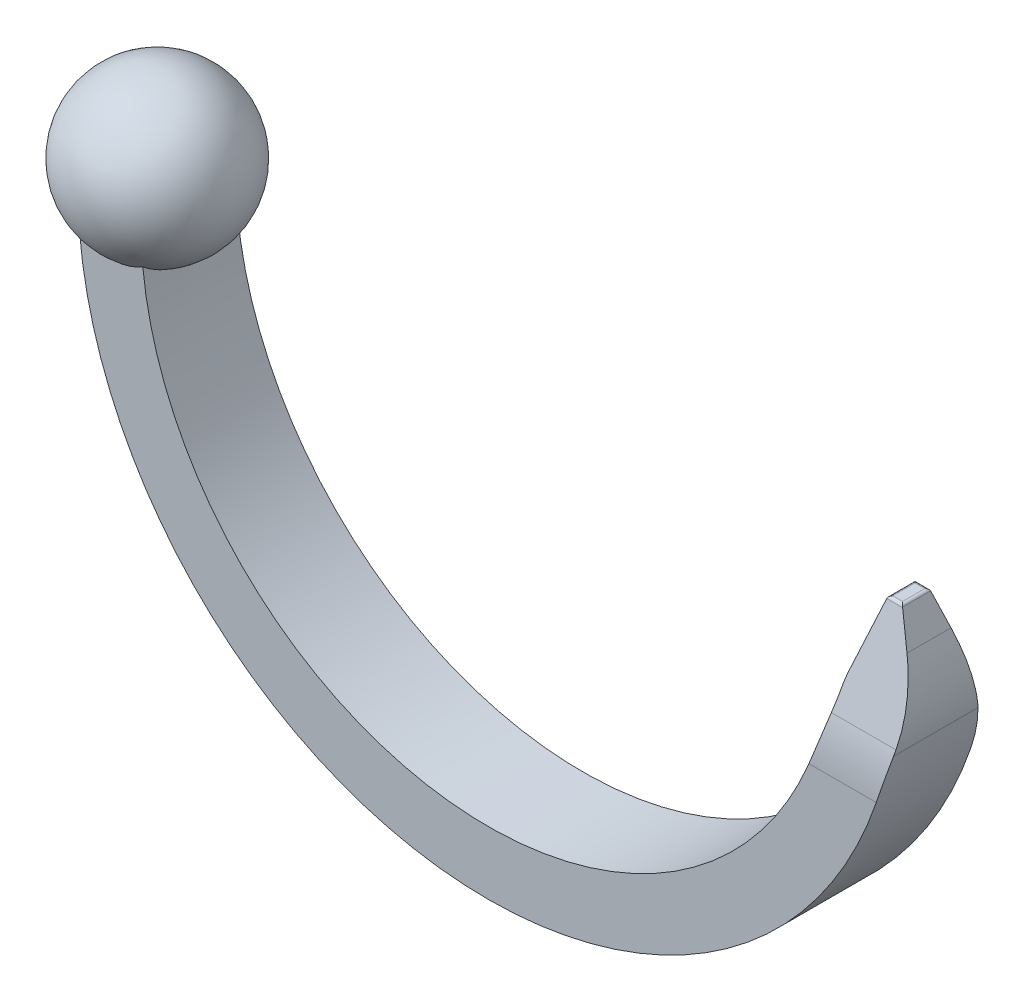
ISO-10303-21;
HEADER;
FILE_DESCRIPTION(('STEP AP214'),'2;1');
FILE_NAME('part.step','',(''),(''),'','','');
FILE_SCHEMA(('AUTOMOTIVE_DESIGN { 1 0 10303 214 1 1 1 1 }'));
ENDSEC;
DATA;
#1=APPLICATION_CONTEXT('core data for automotive mechanical design processes');
#2=APPLICATION_PROTOCOL_DEFINITION('international standard','automotive_design',2000,#1);
#3=PRODUCT_CONTEXT('',#1,'mechanical');
#4=PRODUCT('Part','Part','',(#3));
#5=PRODUCT_RELATED_PRODUCT_CATEGORY('part','',(#4));
#6=PRODUCT_DEFINITION_FORMATION('','',#4);
#7=PRODUCT_DEFINITION_CONTEXT('part definition',#1,'design');
#8=PRODUCT_DEFINITION('design','',#6,#7);
#9=PRODUCT_DEFINITION_SHAPE('','',#8);
#10=(LENGTH_UNIT() NAMED_UNIT(*) SI_UNIT(.MILLI.,.METRE.));
#11=(NAMED_UNIT(*) PLANE_ANGLE_UNIT() SI_UNIT($,.RADIAN.));
#12=(NAMED_UNIT(*) SI_UNIT($,.STERADIAN.) SOLID_ANGLE_UNIT());
#13=UNCERTAINTY_MEASURE_WITH_UNIT(LENGTH_MEASURE(1.E-05),#10,'distance_accuracy_value','');
#14=(GEOMETRIC_REPRESENTATION_CONTEXT(3) GLOBAL_UNCERTAINTY_ASSIGNED_CONTEXT((#13)) GLOBAL_UNIT_ASSIGNED_CONTEXT((#10,
#11,#12)) REPRESENTATION_CONTEXT('',''));
#15=CARTESIAN_POINT('',(0.,0.,0.));
#16=DIRECTION('',(0.,0.,1.));
#17=DIRECTION('',(1.,0.,0.));
#18=AXIS2_PLACEMENT_3D('',#15,#16,#17);
#19=CARTESIAN_POINT('',(-119.848853193976,6.,0.));
#20=DIRECTION('',(0.,1.,0.));
#21=DIRECTION('',(1.,0.,0.));
#22=AXIS2_PLACEMENT_3D('',#19,#20,#21);
#23=SPHERICAL_SURFACE('',#22,25.);
#24=CARTESIAN_POINT('',(-109.440730281031,-11.0782018195431,-15.0002));
#25=CARTESIAN_POINT('',(-109.419584714882,-11.2870913632631,-14.7477011474154));
#26=CARTESIAN_POINT('',(-109.398396098628,-11.4904498426619,-14.490683489929));
#27=CARTESIAN_POINT('',(-109.356144370675,-11.8858420802067,-13.9680896932353));
#28=CARTESIAN_POINT('',(-109.33508125276,-12.0778764034636,-13.7025139821262));
#29=CARTESIAN_POINT('',(-109.272412531229,-12.6364675562246,-12.8938646859805));
#30=CARTESIAN_POINT('',(-109.231308776772,-12.9856949336926,-12.338648212238));
#31=CARTESIAN_POINT('',(-109.152121027545,-13.6353040481111,-11.2011065024627));
#32=CARTESIAN_POINT('',(-109.11403322781,-13.9357478507259,-10.6188169439882));
#33=CARTESIAN_POINT('',(-109.060201750801,-14.3489235506893,-9.72799389688436));
#34=CARTESIAN_POINT('',(-109.042806894257,-14.480408097066,-9.42813383280447));
#35=CARTESIAN_POINT('',(-109.009267255363,-14.7307705687918,-8.82304032065937));
#36=CARTESIAN_POINT('',(-108.993122783065,-14.8496453700511,-8.51780556274182));
#37=CARTESIAN_POINT('',(-108.946818055281,-15.1869199558136,-7.59535284537812));
#38=CARTESIAN_POINT('',(-108.91875800767,-15.3861853723156,-6.97092131144341));
#39=CARTESIAN_POINT('',(-108.869270629455,-15.7325321854508,-5.707494087534));
#40=CARTESIAN_POINT('',(-108.847843389265,-15.8796128707372,-5.06849819915426));
#41=CARTESIAN_POINT('',(-108.821238099708,-16.0605644712825,-4.10252492450907));
#42=CARTESIAN_POINT('',(-108.813291390671,-16.114275819091,-3.7792320292363));
#43=CARTESIAN_POINT('',(-108.79930989642,-16.2084060168954,-3.13076128146649));
#44=CARTESIAN_POINT('',(-108.793274625629,-16.2488282429254,-2.80558392910127));
#45=CARTESIAN_POINT('',(-108.778118720327,-16.3501019043462,-1.82786886765561));
#46=CARTESIAN_POINT('',(-108.771946688121,-16.3909690961476,-1.17310125354047));
#47=CARTESIAN_POINT('',(-108.767659292703,-16.4193925002482,0.148308524760967));
#48=CARTESIAN_POINT('',(-108.769677978401,-16.4060617036464,0.814969022933501));
#49=CARTESIAN_POINT('',(-108.781999541874,-16.3241629843866,2.14482907012261));
#50=CARTESIAN_POINT('',(-108.792302392294,-16.2555952441295,2.80802863056046));
#51=CARTESIAN_POINT('',(-108.820826168587,-16.0635365192936,4.12637703605904));
#52=CARTESIAN_POINT('',(-108.839048476266,-15.9400359498105,4.78152445563997));
#53=CARTESIAN_POINT('',(-108.882750501771,-15.6387266884639,6.07899765143227));
#54=CARTESIAN_POINT('',(-108.908230719356,-15.4609142567765,6.72132254145988));
#55=CARTESIAN_POINT('',(-108.968281755445,-15.0321295571415,8.04962283867253));
#56=CARTESIAN_POINT('',(-109.003492244986,-14.7757559332013,8.73383468001807));
#57=CARTESIAN_POINT('',(-109.079933523955,-14.2004309304969,10.075072344358));
#58=CARTESIAN_POINT('',(-109.121164616907,-13.8814763964946,10.7320967945804));
#59=CARTESIAN_POINT('',(-109.207847504002,-13.1821979001707,12.0145130048553));
#60=CARTESIAN_POINT('',(-109.253308899776,-12.8017328089395,12.6398275692994));
#61=CARTESIAN_POINT('',(-109.322940668308,-12.1875778699167,13.5481194861017));
#62=CARTESIAN_POINT('',(-109.346397118877,-11.975559478449,13.8460060512306));
#63=CARTESIAN_POINT('',(-109.393496658797,-11.5373916365052,14.4312002056846));
#64=CARTESIAN_POINT('',(-109.417139755363,-11.3112416373222,14.7185073835406));
#65=CARTESIAN_POINT('',(-109.440730281031,-11.0782018195431,15.0002));
#66=B_SPLINE_CURVE_WITH_KNOTS('',3,(#24,#25,#26,#27,#28,#29,#30,#31,#32,#33,#34,#35,#36,#37,#38,
#39,#40,#41,#42,#43,#44,#45,#46,#47,#48,#49,#50,#51,#52,#53,#54,#55,#56,#57,#58,#59,#60,#61,#62,
#63,#64,#65),.UNSPECIFIED.,.F.,.F.,(4,2,2,2,2,2,2,2,2,2,2,2,2,2,2,2,2,2,2,2,4),(0.,
0.985001773556479,1.96995435076656,3.93900163046335,5.90552379010287,6.88891829099196,
7.87255586359284,9.83829575712463,11.8040624452597,12.7872779384276,13.7702434573042,
15.7360317417938,17.7341207195464,19.7322030993289,21.7306342495225,23.7292030393725,
25.9204930681447,28.1118936069665,30.3083953413282,31.407184008924,32.5060153671959),.UNSPECIFIED.);
#67=CARTESIAN_POINT('',(-109.440713532555,-11.0783672752506,-15.));
#68=VERTEX_POINT('',#67);
#69=CARTESIAN_POINT('',(-109.440713532555,-11.0783672752506,15.));
#70=VERTEX_POINT('',#69);
#71=EDGE_CURVE('E149',#68,#70,#66,.T.);
#72=ORIENTED_EDGE('',*,*,#71,.F.);
#73=CARTESIAN_POINT('',(-119.848853193976,6.,-15.));
#74=DIRECTION('',(0.,0.,-1.));
#75=DIRECTION('',(-1.,0.,0.));
#76=AXIS2_PLACEMENT_3D('',#73,#74,#75);
#77=CIRCLE('',#76,20.);
#78=CARTESIAN_POINT('',(-129.488234394506,-11.5237647231087,-15.));
#79=VERTEX_POINT('',#78);
#80=EDGE_CURVE('E167',#79,#68,#77,.F.);
#81=ORIENTED_EDGE('',*,*,#80,.F.);
#82=CARTESIAN_POINT('',(-129.488250414337,-11.5235847128404,15.0002));
#83=CARTESIAN_POINT('',(-129.469441658172,-11.7349345550023,14.7653835504821));
#84=CARTESIAN_POINT('',(-129.450542116574,-11.9414447230674,14.526260986837));
#85=CARTESIAN_POINT('',(-129.412733728641,-12.3444445685624,14.0397185289227));
#86=CARTESIAN_POINT('',(-129.393824882337,-12.5409342776533,13.7922986608742));
#87=CARTESIAN_POINT('',(-129.337345677481,-13.1148317344696,13.038104217667));
#88=CARTESIAN_POINT('',(-129.300019526295,-13.4767024249753,12.5193563677164));
#89=CARTESIAN_POINT('',(-129.22740106002,-14.1561187320679,11.4531560245488));
#90=CARTESIAN_POINT('',(-129.192109559169,-14.4736466746126,10.9056922046933));
#91=CARTESIAN_POINT('',(-129.141695416799,-14.914568242242,10.0659930612934));
#92=CARTESIAN_POINT('',(-129.125311009715,-15.0556487629888,9.78300536492846));
#93=CARTESIAN_POINT('',(-129.093525078706,-15.3258042822527,9.21120934379836));
#94=CARTESIAN_POINT('',(-129.07812381962,-15.4548760501234,8.92239947800677));
#95=CARTESIAN_POINT('',(-129.033583667914,-15.8239031491863,8.04735055679619));
#96=CARTESIAN_POINT('',(-129.006145364895,-16.045351315626,7.45309926296155));
#97=CARTESIAN_POINT('',(-128.956846806775,-16.4368695131315,6.24768047529978));
#98=CARTESIAN_POINT('',(-128.934986436978,-16.6069406006589,5.63651332959377));
#99=CARTESIAN_POINT('',(-128.906995823546,-16.8223528262313,4.71070759472949));
#100=CARTESIAN_POINT('',(-128.898466590825,-16.8875339071093,4.40064687910697));
#101=CARTESIAN_POINT('',(-128.883081667032,-17.004550386862,3.77806098846469));
#102=CARTESIAN_POINT('',(-128.876225546022,-17.0563892144565,3.46553646791789));
#103=CARTESIAN_POINT('',(-128.858267344064,-17.1917281008142,2.52496642012269));
#104=CARTESIAN_POINT('',(-128.849772965056,-17.2550692714306,1.89384400422026));
#105=CARTESIAN_POINT('',(-128.840166966771,-17.3266435472093,0.640658983325196));
#106=CARTESIAN_POINT('',(-128.838916913908,-17.3359100033737,0.0186546916058405));
#107=CARTESIAN_POINT('',(-128.843469374791,-17.302043119937,-1.22390045253857));
#108=CARTESIAN_POINT('',(-128.849271859939,-17.2589099928182,-1.84445131084712));
#109=CARTESIAN_POINT('',(-128.867728128208,-17.1205594205016,-3.07996490526414));
#110=CARTESIAN_POINT('',(-128.880384924604,-17.0253190678701,-3.69492506261523));
#111=CARTESIAN_POINT('',(-128.904153955021,-16.8440695227924,-4.60941900411936));
#112=CARTESIAN_POINT('',(-128.912874689458,-16.7772516005374,-4.9129372112833));
#113=CARTESIAN_POINT('',(-128.931831557263,-16.6309429114318,-5.51693657953315));
#114=CARTESIAN_POINT('',(-128.942068060334,-16.551449052494,-5.81741698052901));
#115=CARTESIAN_POINT('',(-128.974778492097,-16.2952818443451,-6.70966440757222));
#116=CARTESIAN_POINT('',(-128.999357154338,-16.1001441975995,-7.29615501065662));
#117=CARTESIAN_POINT('',(-129.053277173538,-15.6620647391641,-8.45077133502764));
#118=CARTESIAN_POINT('',(-129.082618602748,-15.4191222022652,-9.018896777559));
#119=CARTESIAN_POINT('',(-129.129400245865,-15.0205128876838,-9.85418105564973));
#120=CARTESIAN_POINT('',(-129.145450451145,-14.8819908031382,-10.129711263382));
#121=CARTESIAN_POINT('',(-129.178331195051,-14.593827014288,-10.6747559696718));
#122=CARTESIAN_POINT('',(-129.195161543602,-14.4441880132195,-10.9442719100905));
#123=CARTESIAN_POINT('',(-129.246599566332,-13.9790497855856,-11.7431076097254));
#124=CARTESIAN_POINT('',(-129.282169530783,-13.6472007138865,-12.2629844763306));
#125=CARTESIAN_POINT('',(-129.346347291972,-13.0229477390939,-13.1587334649153));
#126=CARTESIAN_POINT('',(-129.374694478365,-12.7387880729912,-13.540424288329));
#127=CARTESIAN_POINT('',(-129.431512996698,-12.1478945666561,-14.284705190256));
#128=CARTESIAN_POINT('',(-129.459983985217,-11.8412051734247,-14.6473305776516));
#129=CARTESIAN_POINT('',(-129.488250414337,-11.5235847128404,-15.0002));
#130=B_SPLINE_CURVE_WITH_KNOTS('',3,(#82,#83,#84,#85,#86,#87,#88,#89,#90,#91,#92,#93,#94,#95,
#96,#97,#98,#99,#100,#101,#102,#103,#104,#105,#106,#107,#108,#109,#110,#111,#112,#113,#114,#115,
#116,#117,#118,#119,#120,#121,#122,#123,#124,#125,#126,#127,#128,#129),.UNSPECIFIED.,.F.,.F.,(4,
2,2,2,2,2,2,2,2,2,2,2,2,2,2,2,2,2,2,2,2,2,2,4),(0.,0.949317218451932,1.89863143721149,
3.7971049016316,5.69633290914246,6.64597342696884,7.59586868689514,9.49771275710965,
11.399517717233,12.3501158628158,13.3004694772766,15.2009297791083,17.0649508049354,
18.9289642721126,20.7937978580979,21.7262848569343,22.6589996696554,24.512482038593,
26.3659925273814,27.292189141746,28.2181612708136,30.0692118830827,31.4984398850773,
32.9249203233387),.UNSPECIFIED.);
#131=CARTESIAN_POINT('',(-129.488234394506,-11.5237647231086,15.));
#132=VERTEX_POINT('',#131);
#133=EDGE_CURVE('E152',#132,#79,#130,.T.);
#134=ORIENTED_EDGE('',*,*,#133,.F.);
#135=CARTESIAN_POINT('',(-119.848853193976,6.,15.));
#136=DIRECTION('',(0.,0.,1.));
#137=DIRECTION('',(1.,0.,0.));
#138=AXIS2_PLACEMENT_3D('',#135,#136,#137);
#139=CIRCLE('',#138,20.);
#140=EDGE_CURVE('E147',#70,#132,#139,.F.);
#141=ORIENTED_EDGE('',*,*,#140,.F.);
#142=EDGE_LOOP('',(#72,#81,#134,#141));
#143=FACE_BOUND('',#142,.T.);
#144=ADVANCED_FACE('F37',(#143),#23,.T.);
#145=CARTESIAN_POINT('',(0.,0.,87.6720009699375));
#146=DIRECTION('',(0.,0.,1.));
#147=DIRECTION('',(1.,0.,0.));
#148=AXIS2_PLACEMENT_3D('',#145,#146,#147);
#149=CYLINDRICAL_SURFACE('',#148,110.);
#150=CARTESIAN_POINT('',(0.,0.,5.88972745734179));
#151=DIRECTION('',(0.,0.258819045102518,0.965925826289069));
#152=DIRECTION('',(0.,-0.965925826289069,0.258819045102518));
#153=AXIS2_PLACEMENT_3D('',#150,#151,#152);
#154=ELLIPSE('',#153,113.880379845109,110.);
#155=CARTESIAN_POINT('',(106.792428209854,-26.3700071490931,12.9555495773441));
#156=VERTEX_POINT('',#155);
#157=CARTESIAN_POINT('',(108.217581825865,-19.7219416833712,11.1742058045747));
#158=VERTEX_POINT('',#157);
#159=EDGE_CURVE('E196',#156,#158,#154,.T.);
#160=ORIENTED_EDGE('',*,*,#159,.T.);
#161=DIRECTION('',(0.,0.,1.));
#162=VECTOR('',#161,1.);
#163=CARTESIAN_POINT('',(108.217581825865,-19.7219416833712,87.6720009699375));
#164=LINE('',#163,#162);
#165=CARTESIAN_POINT('',(108.217581825865,-19.7219416833713,-11.1742058045747));
#166=VERTEX_POINT('',#165);
#167=EDGE_CURVE('E308',#158,#166,#164,.F.);
#168=ORIENTED_EDGE('',*,*,#167,.T.);
#169=CARTESIAN_POINT('',(0.,0.,-5.88972745734155));
#170=DIRECTION('',(0.,0.258819045102528,-0.965925826289066));
#171=DIRECTION('',(0.,0.965925826289067,0.258819045102528));
#172=AXIS2_PLACEMENT_3D('',#169,#170,#171);
#173=ELLIPSE('',#172,113.880379845109,110.);
#174=CARTESIAN_POINT('',(106.792428209854,-26.3700071490924,-12.955549577344));
#175=VERTEX_POINT('',#174);
#176=EDGE_CURVE('E198',#166,#175,#173,.T.);
#177=ORIENTED_EDGE('',*,*,#176,.T.);
#178=CARTESIAN_POINT('',(106.792428209854,-26.3700071490924,-12.955549577344));
#179=CARTESIAN_POINT('',(106.632226556986,-27.0188305871477,-13.1294115495298));
#180=CARTESIAN_POINT('',(106.465388509771,-27.6690370942057,-13.2919458906141));
#181=CARTESIAN_POINT('',(106.118456281003,-28.9711335800531,-13.5944777319424));
#182=CARTESIAN_POINT('',(105.938362498019,-29.6230235076575,-13.7344759093948));
#183=CARTESIAN_POINT('',(105.565931316575,-30.9239310860472,-13.9913707122522));
#184=CARTESIAN_POINT('',(105.373665073714,-31.5729453000032,-14.1083876818419));
#185=CARTESIAN_POINT('',(104.976134812833,-32.8705313884098,-14.3204551976897));
#186=CARTESIAN_POINT('',(104.770870779967,-33.5191032623542,-14.4155057188567));
#187=CARTESIAN_POINT('',(104.135752370579,-35.4626705589452,-14.6680614617289));
#188=CARTESIAN_POINT('',(103.686485594034,-36.7558189550307,-14.793029972953));
#189=CARTESIAN_POINT('',(102.974004140219,-38.6888941242464,-14.9175674587548));
#190=CARTESIAN_POINT('',(102.729346332777,-39.3339269844473,-14.9485918859419));
#191=CARTESIAN_POINT('',(102.22771576535,-40.6198264991381,-14.9898067373949));
#192=CARTESIAN_POINT('',(101.970743542954,-41.2606933341129,-14.9999980702918));
#193=CARTESIAN_POINT('',(101.707724590651,-41.899149855244,-15.));
#194=B_SPLINE_CURVE_WITH_KNOTS('',3,(#178,#179,#180,#181,#182,#183,#184,#185,#186,#187,#188,
#189,#190,#191,#192,#193),.UNSPECIFIED.,.F.,.F.,(4,2,2,2,2,2,2,4),(0.,2.07151356494067,
4.14296486957488,6.20326121462204,8.26355991301444,12.3832029026268,14.4545640725382,
16.525834898533),.UNSPECIFIED.);
#195=CARTESIAN_POINT('',(101.707724590651,-41.899149855244,-15.));
#196=VERTEX_POINT('',#195);
#197=EDGE_CURVE('E243',#175,#196,#194,.T.);
#198=ORIENTED_EDGE('',*,*,#197,.T.);
#199=CARTESIAN_POINT('',(0.,0.,-15.));
#200=DIRECTION('',(0.,0.,1.));
#201=DIRECTION('',(1.,0.,0.));
#202=AXIS2_PLACEMENT_3D('',#199,#200,#201);
#203=CIRCLE('',#202,110.);
#204=EDGE_CURVE('E158',#68,#196,#203,.T.);
#205=ORIENTED_EDGE('',*,*,#204,.F.);
#206=ORIENTED_EDGE('',*,*,#71,.T.);
#207=CARTESIAN_POINT('',(0.,0.,15.));
#208=DIRECTION('',(0.,0.,1.));
#209=DIRECTION('',(1.,0.,0.));
#210=AXIS2_PLACEMENT_3D('',#207,#208,#209);
#211=CIRCLE('',#210,110.);
#212=CARTESIAN_POINT('',(101.707724590651,-41.8991498552442,15.));
#213=VERTEX_POINT('',#212);
#214=EDGE_CURVE('E165',#70,#213,#211,.T.);
#215=ORIENTED_EDGE('',*,*,#214,.T.);
#216=CARTESIAN_POINT('',(101.707724590651,-41.8991498552442,15.));
#217=CARTESIAN_POINT('',(101.970743542954,-41.2606933341131,14.9999980702918));
#218=CARTESIAN_POINT('',(102.22771576535,-40.6198264991383,14.9898067373949));
#219=CARTESIAN_POINT('',(102.729346332777,-39.3339269844476,14.9485918859419));
#220=CARTESIAN_POINT('',(102.974004140218,-38.6888941242467,14.9175674587548));
#221=CARTESIAN_POINT('',(103.686485594033,-36.7558189550311,14.793029972953));
#222=CARTESIAN_POINT('',(104.135752370579,-35.4626705589456,14.6680614617289));
#223=CARTESIAN_POINT('',(104.770870779967,-33.5191032623547,14.4155057188567));
#224=CARTESIAN_POINT('',(104.976134812833,-32.8705313884103,14.3204551976897));
#225=CARTESIAN_POINT('',(105.373665073714,-31.5729453000038,14.108387681842));
#226=CARTESIAN_POINT('',(105.565931316575,-30.9239310860478,13.9913707122523));
#227=CARTESIAN_POINT('',(105.938362498019,-29.6230235076582,13.7344759093949));
#228=CARTESIAN_POINT('',(106.118456281003,-28.9711335800538,13.5944777319425));
#229=CARTESIAN_POINT('',(106.465388509771,-27.6690370942065,13.2919458906142));
#230=CARTESIAN_POINT('',(106.632226556986,-27.0188305871484,13.12941154953));
#231=CARTESIAN_POINT('',(106.792428209854,-26.3700071490931,12.9555495773441));
#232=B_SPLINE_CURVE_WITH_KNOTS('',3,(#216,#217,#218,#219,#220,#221,#222,#223,#224,#225,#226,
#227,#228,#229,#230,#231),.UNSPECIFIED.,.F.,.F.,(4,2,2,2,2,2,2,4),(0.,2.07127082599477,
4.14263199590609,8.26227498551828,10.3225736839106,12.3828700289577,14.4543213335918,
16.5258348985324),.UNSPECIFIED.);
#233=EDGE_CURVE('E237',#213,#156,#232,.T.);
#234=ORIENTED_EDGE('',*,*,#233,.T.);
#235=EDGE_LOOP('',(#160,#168,#177,#198,#205,#206,#215,#234));
#236=FACE_BOUND('',#235,.T.);
#237=ADVANCED_FACE('F164',(#236),#149,.F.);
#238=CARTESIAN_POINT('',(0.,0.,87.6720009699375));
#239=DIRECTION('',(0.,0.,1.));
#240=DIRECTION('',(1.,0.,0.));
#241=AXIS2_PLACEMENT_3D('',#238,#239,#240);
#242=CYLINDRICAL_SURFACE('',#241,130.);
#243=CARTESIAN_POINT('',(123.062834525326,-41.899149855244,-15.));
#244=CARTESIAN_POINT('',(123.282023642352,-41.2553784371453,-15.0000014853387));
#245=CARTESIAN_POINT('',(123.496138099011,-40.6099250189488,-14.9896377649666));
#246=CARTESIAN_POINT('',(123.914032394194,-39.3163381022198,-14.9478765191552));
#247=CARTESIAN_POINT('',(124.117811911867,-38.668204521156,-14.916478341127));
#248=CARTESIAN_POINT('',(124.711282597781,-36.7276302378059,-14.790716087875));
#249=CARTESIAN_POINT('',(125.085392302389,-35.4322959880846,-14.6647894652759));
#250=CARTESIAN_POINT('',(125.790572340569,-32.8410543358981,-14.326705804495));
#251=CARTESIAN_POINT('',(126.121640887396,-31.5451469118784,-14.1145451880344));
#252=CARTESIAN_POINT('',(126.586293866743,-29.6033237797161,-13.7303273940283));
#253=CARTESIAN_POINT('',(126.736199902793,-28.9547106857585,-13.5908106602767));
#254=CARTESIAN_POINT('',(127.025022483971,-27.6601461345519,-13.2897284924773));
#255=CARTESIAN_POINT('',(127.163938794306,-27.0141947344484,-13.1281625875571));
#256=CARTESIAN_POINT('',(127.297379089111,-26.3700071490924,-12.955549577344));
#257=B_SPLINE_CURVE_WITH_KNOTS('',3,(#243,#244,#245,#246,#247,#248,#249,#250,#251,#252,#253,
#254,#255,#256),.UNSPECIFIED.,.F.,.F.,(4,2,2,2,2,2,4),(0.,2.03999654613047,4.08005638558219,
8.13892836853953,12.1979687915504,14.2380918100343,16.2782584033087),.UNSPECIFIED.);
#258=CARTESIAN_POINT('',(123.062834525326,-41.899149855244,-15.));
#259=VERTEX_POINT('',#258);
#260=CARTESIAN_POINT('',(126.927739164324,-28.0953560332198,-13.3905409815584));
#261=VERTEX_POINT('',#260);
#262=EDGE_CURVE('E212',#259,#261,#257,.T.);
#263=ORIENTED_EDGE('',*,*,#262,.T.);
#264=DIRECTION('',(0.,0.,1.));
#265=VECTOR('',#264,1.);
#266=CARTESIAN_POINT('',(126.927739164324,-28.0953560332198,87.6720009699375));
#267=LINE('',#266,#265);
#268=CARTESIAN_POINT('',(126.927739164324,-28.0953560332198,13.3905409815583));
#269=VERTEX_POINT('',#268);
#270=EDGE_CURVE('E325',#261,#269,#267,.T.);
#271=ORIENTED_EDGE('',*,*,#270,.T.);
#272=CARTESIAN_POINT('',(127.297379089111,-26.3700071490931,12.9555495773441));
#273=CARTESIAN_POINT('',(127.163938794306,-27.0141947344492,13.1281625875572));
#274=CARTESIAN_POINT('',(127.02502248397,-27.6601461345526,13.2897284924774));
#275=CARTESIAN_POINT('',(126.736199902793,-28.9547106857592,13.5908106602768));
#276=CARTESIAN_POINT('',(126.586293866742,-29.6033237797167,13.7303273940284));
#277=CARTESIAN_POINT('',(126.121640887396,-31.545146911879,14.1145451880345));
#278=CARTESIAN_POINT('',(125.790572340569,-32.8410543358986,14.3267058044951));
#279=CARTESIAN_POINT('',(125.085392302389,-35.432295988085,14.664789465276));
#280=CARTESIAN_POINT('',(124.711282597781,-36.7276302378063,14.790716087875));
#281=CARTESIAN_POINT('',(124.117811911867,-38.6682045211562,14.916478341127));
#282=CARTESIAN_POINT('',(123.914032394194,-39.3163381022201,14.9478765191552));
#283=CARTESIAN_POINT('',(123.496138099011,-40.609925018949,14.9896377649666));
#284=CARTESIAN_POINT('',(123.282023642352,-41.2553784371455,15.0000014853387));
#285=CARTESIAN_POINT('',(123.062834525326,-41.8991498552442,15.));
#286=B_SPLINE_CURVE_WITH_KNOTS('',3,(#272,#273,#274,#275,#276,#277,#278,#279,#280,#281,#282,
#283,#284,#285),.UNSPECIFIED.,.F.,.F.,(4,2,2,2,2,2,4),(0.,2.04016659327428,4.08028961175809,
8.13933003476887,12.198202017726,14.2382618571777,16.2782584033081),.UNSPECIFIED.);
#287=CARTESIAN_POINT('',(123.062834525326,-41.8991498552442,15.));
#288=VERTEX_POINT('',#287);
#289=EDGE_CURVE('E204',#269,#288,#286,.T.);
#290=ORIENTED_EDGE('',*,*,#289,.T.);
#291=CARTESIAN_POINT('',(0.,0.,15.));
#292=DIRECTION('',(0.,0.,1.));
#293=DIRECTION('',(1.,0.,0.));
#294=AXIS2_PLACEMENT_3D('',#291,#292,#293);
#295=CIRCLE('',#294,130.);
#296=EDGE_CURVE('E173',#132,#288,#295,.T.);
#297=ORIENTED_EDGE('',*,*,#296,.F.);
#298=ORIENTED_EDGE('',*,*,#133,.T.);
#299=CARTESIAN_POINT('',(0.,0.,-15.));
#300=DIRECTION('',(0.,0.,1.));
#301=DIRECTION('',(1.,0.,0.));
#302=AXIS2_PLACEMENT_3D('',#299,#300,#301);
#303=CIRCLE('',#302,130.);
#304=EDGE_CURVE('E175',#79,#259,#303,.T.);
#305=ORIENTED_EDGE('',*,*,#304,.T.);
#306=EDGE_LOOP('',(#263,#271,#290,#297,#298,#305));
#307=FACE_BOUND('',#306,.T.);
#308=ADVANCED_FACE('F219',(#307),#242,.T.);
#309=CARTESIAN_POINT('',(110.,0.,-15.));
#310=DIRECTION('',(0.,0.,-1.));
#311=DIRECTION('',(-1.,0.,0.));
#312=AXIS2_PLACEMENT_3D('',#309,#310,#311);
#313=PLANE('',#312);
#314=ORIENTED_EDGE('',*,*,#204,.T.);
#315=DIRECTION('',(1.,0.,0.));
#316=VECTOR('',#315,1.);
#317=CARTESIAN_POINT('',(110.,-41.899149855244,-15.));
#318=LINE('',#317,#316);
#319=EDGE_CURVE('E201',#196,#259,#318,.T.);
#320=ORIENTED_EDGE('',*,*,#319,.T.);
#321=ORIENTED_EDGE('',*,*,#304,.F.);
#322=ORIENTED_EDGE('',*,*,#80,.T.);
#323=EDGE_LOOP('',(#314,#320,#321,#322));
#324=FACE_BOUND('',#323,.T.);
#325=ADVANCED_FACE('F253',(#324),#313,.T.);
#326=CARTESIAN_POINT('',(110.,0.,15.));
#327=DIRECTION('',(0.,0.,1.));
#328=DIRECTION('',(1.,0.,0.));
#329=AXIS2_PLACEMENT_3D('',#326,#327,#328);
#330=PLANE('',#329);
#331=ORIENTED_EDGE('',*,*,#296,.T.);
#332=DIRECTION('',(-1.,0.,0.));
#333=VECTOR('',#332,1.);
#334=CARTESIAN_POINT('',(110.,-41.8991498552442,15.));
#335=LINE('',#334,#333);
#336=EDGE_CURVE('E172',#288,#213,#335,.T.);
#337=ORIENTED_EDGE('',*,*,#336,.T.);
#338=ORIENTED_EDGE('',*,*,#214,.F.);
#339=ORIENTED_EDGE('',*,*,#140,.T.);
#340=EDGE_LOOP('',(#331,#337,#338,#339));
#341=FACE_BOUND('',#340,.T.);
#342=ADVANCED_FACE('F170',(#341),#330,.T.);
#343=CARTESIAN_POINT('',(-312.834842680956,6.00000000000001,-15.));
#344=DIRECTION('',(0.,-1.,0.));
#345=DIRECTION('',(1.,0.,0.));
#346=AXIS2_PLACEMENT_3D('',#343,#344,#345);
#347=PLANE('',#346);
#348=DIRECTION('',(0.,0.,-1.));
#349=VECTOR('',#348,1.);
#350=CARTESIAN_POINT('',(116.840006838819,6.,4.28203230275508));
#351=LINE('',#350,#349);
#352=CARTESIAN_POINT('',(116.840006838819,6.,-3.51470531477581));
#353=VERTEX_POINT('',#352);
#354=CARTESIAN_POINT('',(116.840006838819,6.,3.51470531477612));
#355=VERTEX_POINT('',#354);
#356=EDGE_CURVE('E352',#353,#355,#351,.F.);
#357=ORIENTED_EDGE('',*,*,#356,.T.);
#358=DIRECTION('',(1.,0.,0.));
#359=VECTOR('',#358,1.);
#360=CARTESIAN_POINT('',(120.596700421459,6.,3.51470531477612));
#361=LINE('',#360,#359);
#362=CARTESIAN_POINT('',(119.930355080542,6.,3.51470531477612));
#363=VERTEX_POINT('',#362);
#364=EDGE_CURVE('E354',#355,#363,#361,.T.);
#365=ORIENTED_EDGE('',*,*,#364,.T.);
#366=DIRECTION('',(0.,0.,-1.));
#367=VECTOR('',#366,1.);
#368=CARTESIAN_POINT('',(119.930355080542,6.,-4.28203230275477));
#369=LINE('',#368,#367);
#370=CARTESIAN_POINT('',(119.930355080542,6.,-3.51470531477581));
#371=VERTEX_POINT('',#370);
#372=EDGE_CURVE('E348',#363,#371,#369,.T.);
#373=ORIENTED_EDGE('',*,*,#372,.T.);
#374=DIRECTION('',(-1.,0.,0.));
#375=VECTOR('',#374,1.);
#376=CARTESIAN_POINT('',(116.110498666915,6.,-3.51470531477581));
#377=LINE('',#376,#375);
#378=EDGE_CURVE('E350',#371,#353,#377,.T.);
#379=ORIENTED_EDGE('',*,*,#378,.T.);
#380=EDGE_LOOP('',(#357,#365,#373,#379));
#381=FACE_BOUND('',#380,.T.);
#382=ADVANCED_FACE('F264',(#381),#347,.F.);
#383=CARTESIAN_POINT('',(116.110498666915,6.,87.6720009699375));
#384=DIRECTION('',(0.952247304294684,-0.305327809842974,0.));
#385=DIRECTION('',(0.,0.,1.));
#386=AXIS2_PLACEMENT_3D('',#383,#384,#385);
#387=PLANE('',#386);
#388=DIRECTION('',(-0.295849237559095,-0.922685814594391,0.247232918888217));
#389=VECTOR('',#388,1.);
#390=CARTESIAN_POINT('',(110.011050271331,-13.0227784863933,9.37917043598023));
#391=LINE('',#390,#389);
#392=CARTESIAN_POINT('',(109.479537590755,-14.6804444472418,9.82334069151015));
#393=VERTEX_POINT('',#392);
#394=CARTESIAN_POINT('',(115.872847001601,5.25881904510252,4.48063114106518));
#395=VERTEX_POINT('',#394);
#396=EDGE_CURVE('E192',#393,#395,#391,.F.);
#397=ORIENTED_EDGE('',*,*,#396,.T.);
#398=CARTESIAN_POINT('',(115.789859471124,5.,3.51470531477612));
#399=DIRECTION('',(0.952247304294684,-0.305327809842974,0.));
#400=DIRECTION('',(-0.305327809842974,-0.952247304294684,0.));
#401=AXIS2_PLACEMENT_3D('',#398,#399,#400);
#402=ELLIPSE('',#401,1.05014736769529,1.);
#403=CARTESIAN_POINT('',(115.887759534524,5.30532780984299,4.4669526190708));
#404=VERTEX_POINT('',#403);
#405=EDGE_CURVE('E46',#395,#404,#402,.F.);
#406=ORIENTED_EDGE('',*,*,#405,.T.);
#407=DIRECTION('',(0.,0.,1.));
#408=VECTOR('',#407,1.);
#409=CARTESIAN_POINT('',(115.887759534524,5.30532780984299,-4.28203230275476));
#410=LINE('',#409,#408);
#411=CARTESIAN_POINT('',(115.887759534524,5.30532780984299,-4.46695261907049));
#412=VERTEX_POINT('',#411);
#413=EDGE_CURVE('E57',#404,#412,#410,.F.);
#414=ORIENTED_EDGE('',*,*,#413,.T.);
#415=CARTESIAN_POINT('',(115.789859471124,5.,-3.51470531477581));
#416=DIRECTION('',(0.952247304294684,-0.305327809842974,0.));
#417=DIRECTION('',(0.305327809842974,0.952247304294684,0.));
#418=AXIS2_PLACEMENT_3D('',#415,#416,#417);
#419=ELLIPSE('',#418,1.05014736769529,1.);
#420=CARTESIAN_POINT('',(115.872847001601,5.25881904510253,-4.48063114106488));
#421=VERTEX_POINT('',#420);
#422=EDGE_CURVE('E366',#412,#421,#419,.F.);
#423=ORIENTED_EDGE('',*,*,#422,.T.);
#424=DIRECTION('',(0.295849237559094,0.922685814594389,0.247232918888226));
#425=VECTOR('',#424,1.);
#426=CARTESIAN_POINT('',(122.836354182594,26.9763984066026,1.33857671040805));
#427=LINE('',#426,#425);
#428=CARTESIAN_POINT('',(109.479537590755,-14.6804444472418,-9.82334069151007));
#429=VERTEX_POINT('',#428);
#430=EDGE_CURVE('E194',#421,#429,#427,.F.);
#431=ORIENTED_EDGE('',*,*,#430,.T.);
#432=DIRECTION('',(0.,0.,-1.));
#433=VECTOR('',#432,1.);
#434=CARTESIAN_POINT('',(109.479537590755,-14.6804444472418,87.6720009699375));
#435=LINE('',#434,#433);
#436=EDGE_CURVE('E318',#429,#393,#435,.F.);
#437=ORIENTED_EDGE('',*,*,#436,.T.);
#438=EDGE_LOOP('',(#397,#406,#414,#423,#431,#437));
#439=FACE_BOUND('',#438,.T.);
#440=ADVANCED_FACE('F255',(#439),#387,.F.);
#441=CARTESIAN_POINT('',(120.596700421459,6.,87.6720009699375));
#442=DIRECTION('',(0.922905686094822,0.385026095964736,0.));
#443=DIRECTION('',(0.,0.,1.));
#444=AXIS2_PLACEMENT_3D('',#441,#442,#443);
#445=PLANE('',#444);
#446=DIRECTION('',(0.,0.,-1.));
#447=VECTOR('',#446,1.);
#448=CARTESIAN_POINT('',(120.853260766636,5.38502609596474,4.28203230275507));
#449=LINE('',#448,#447);
#450=CARTESIAN_POINT('',(120.853260766636,5.38502609596474,-4.43761100087063));
#451=VERTEX_POINT('',#450);
#452=CARTESIAN_POINT('',(120.853260766636,5.38502609596474,4.43761100087094));
#453=VERTEX_POINT('',#452);
#454=EDGE_CURVE('E357',#451,#453,#449,.F.);
#455=ORIENTED_EDGE('',*,*,#454,.T.);
#456=CARTESIAN_POINT('',(121.013889416787,5.,3.51470531477612));
#457=DIRECTION('',(0.922905686094822,0.385026095964736,0.));
#458=DIRECTION('',(-0.385026095964736,0.922905686094822,0.));
#459=AXIS2_PLACEMENT_3D('',#456,#457,#458);
#460=ELLIPSE('',#459,1.08353433624555,1.);
#461=CARTESIAN_POINT('',(120.905912959389,5.25881904510252,4.48063114106519));
#462=VERTEX_POINT('',#461);
#463=EDGE_CURVE('E361',#453,#462,#460,.T.);
#464=ORIENTED_EDGE('',*,*,#463,.T.);
#465=DIRECTION('',(0.373767134747521,-0.895918010620897,0.240060507430364));
#466=VECTOR('',#465,1.);
#467=CARTESIAN_POINT('',(128.079009460346,-11.9350585050741,9.08771674539456));
#468=LINE('',#467,#466);
#469=CARTESIAN_POINT('',(124.789277634479,-4.04958726133197,6.97481109369505));
#470=VERTEX_POINT('',#469);
#471=EDGE_CURVE('E157',#462,#470,#468,.T.);
#472=ORIENTED_EDGE('',*,*,#471,.T.);
#473=DIRECTION('',(0.,0.,1.));
#474=VECTOR('',#473,1.);
#475=CARTESIAN_POINT('',(124.789277634479,-4.04958726133197,87.6720009699375));
#476=LINE('',#475,#474);
#477=CARTESIAN_POINT('',(124.789277634479,-4.04958726133197,-6.97481109369484));
#478=VERTEX_POINT('',#477);
#479=EDGE_CURVE('E332',#470,#478,#476,.F.);
#480=ORIENTED_EDGE('',*,*,#479,.T.);
#481=DIRECTION('',(-0.37376713474752,0.895918010620894,0.240060507430373));
#482=VECTOR('',#481,1.);
#483=CARTESIAN_POINT('',(112.345965886896,25.7769706942264,1.01719102349733));
#484=LINE('',#483,#482);
#485=CARTESIAN_POINT('',(120.905912959389,5.25881904510253,-4.48063114106487));
#486=VERTEX_POINT('',#485);
#487=EDGE_CURVE('E189',#478,#486,#484,.T.);
#488=ORIENTED_EDGE('',*,*,#487,.T.);
#489=CARTESIAN_POINT('',(121.013889416787,5.,-3.51470531477581));
#490=DIRECTION('',(0.922905686094822,0.385026095964736,0.));
#491=DIRECTION('',(0.385026095964736,-0.922905686094822,0.));
#492=AXIS2_PLACEMENT_3D('',#489,#490,#491);
#493=ELLIPSE('',#492,1.08353433624555,1.);
#494=EDGE_CURVE('E359',#486,#451,#493,.T.);
#495=ORIENTED_EDGE('',*,*,#494,.T.);
#496=EDGE_LOOP('',(#455,#464,#472,#480,#488,#495));
#497=FACE_BOUND('',#496,.T.);
#498=ADVANCED_FACE('F263',(#497),#445,.T.);
#499=CARTESIAN_POINT('',(110.,-34.0000000000001,-15.));
#500=DIRECTION('',(0.,0.258819045102528,-0.965925826289066));
#501=DIRECTION('',(-1.,0.,0.));
#502=AXIS2_PLACEMENT_3D('',#499,#500,#501);
#503=PLANE('',#502);
#504=ORIENTED_EDGE('',*,*,#430,.F.);
#505=DIRECTION('',(-1.,0.,0.));
#506=VECTOR('',#505,1.);
#507=CARTESIAN_POINT('',(120.596700421459,5.25881904510253,-4.48063114106487));
#508=LINE('',#507,#506);
#509=EDGE_CURVE('E11',#421,#486,#508,.F.);
#510=ORIENTED_EDGE('',*,*,#509,.T.);
#511=ORIENTED_EDGE('',*,*,#487,.F.);
#512=CARTESIAN_POINT('',(87.8730501906857,-19.4506310999214,-11.1015083528413));
#513=DIRECTION('',(0.,0.258819045102528,-0.965925826289066));
#514=DIRECTION('',(0.,0.965925826289067,0.258819045102528));
#515=AXIS2_PLACEMENT_3D('',#512,#513,#514);
#516=ELLIPSE('',#515,41.4110472164034,40.);
#517=CARTESIAN_POINT('',(127.27003275395,-26.3700071490924,-12.955549577344));
#518=VERTEX_POINT('',#517);
#519=EDGE_CURVE('E313',#478,#518,#516,.T.);
#520=ORIENTED_EDGE('',*,*,#519,.T.);
#521=DIRECTION('',(1.,0.,0.));
#522=VECTOR('',#521,1.);
#523=CARTESIAN_POINT('',(110.,-26.3700071490924,-12.955549577344));
#524=LINE('',#523,#522);
#525=EDGE_CURVE('E244',#518,#175,#524,.F.);
#526=ORIENTED_EDGE('',*,*,#525,.T.);
#527=ORIENTED_EDGE('',*,*,#176,.F.);
#528=CARTESIAN_POINT('',(147.569429762543,-26.8935568409608,-13.0958342944777));
#529=DIRECTION('',(0.,0.258819045102528,-0.965925826289066));
#530=DIRECTION('',(0.,0.965925826289067,0.258819045102528));
#531=AXIS2_PLACEMENT_3D('',#528,#529,#530);
#532=ELLIPSE('',#531,41.4110472164034,40.);
#533=EDGE_CURVE('E315',#166,#429,#532,.T.);
#534=ORIENTED_EDGE('',*,*,#533,.T.);
#535=EDGE_LOOP('',(#504,#510,#511,#520,#526,#527,#534));
#536=FACE_BOUND('',#535,.T.);
#537=ADVANCED_FACE('F270',(#536),#503,.T.);
#538=CARTESIAN_POINT('',(-312.834842680956,6.00000000000001,4.28203230275508));
#539=DIRECTION('',(0.,0.258819045102518,0.965925826289069));
#540=DIRECTION('',(-1.,0.,0.));
#541=AXIS2_PLACEMENT_3D('',#538,#539,#540);
#542=PLANE('',#541);
#543=ORIENTED_EDGE('',*,*,#471,.F.);
#544=DIRECTION('',(1.,0.,0.));
#545=VECTOR('',#544,1.);
#546=CARTESIAN_POINT('',(116.110498666915,5.25881904510252,4.48063114106518));
#547=LINE('',#546,#545);
#548=EDGE_CURVE('E363',#462,#395,#547,.F.);
#549=ORIENTED_EDGE('',*,*,#548,.T.);
#550=ORIENTED_EDGE('',*,*,#396,.F.);
#551=CARTESIAN_POINT('',(147.569429762543,-26.8935568409608,13.0958342944776));
#552=DIRECTION('',(0.,0.258819045102518,0.965925826289069));
#553=DIRECTION('',(0.,-0.965925826289069,0.258819045102518));
#554=AXIS2_PLACEMENT_3D('',#551,#552,#553);
#555=ELLIPSE('',#554,41.4110472164033,40.);
#556=EDGE_CURVE('E323',#393,#158,#555,.T.);
#557=ORIENTED_EDGE('',*,*,#556,.T.);
#558=ORIENTED_EDGE('',*,*,#159,.F.);
#559=DIRECTION('',(-1.,0.,0.));
#560=VECTOR('',#559,1.);
#561=CARTESIAN_POINT('',(-312.834842680956,-26.3700071490931,12.9555495773441));
#562=LINE('',#561,#560);
#563=CARTESIAN_POINT('',(127.27003275395,-26.3700071490931,12.9555495773441));
#564=VERTEX_POINT('',#563);
#565=EDGE_CURVE('E306',#156,#564,#562,.F.);
#566=ORIENTED_EDGE('',*,*,#565,.T.);
#567=CARTESIAN_POINT('',(87.8730501906857,-19.4506310999214,11.1015083528413));
#568=DIRECTION('',(0.,0.258819045102518,0.965925826289069));
#569=DIRECTION('',(0.,-0.965925826289069,0.258819045102518));
#570=AXIS2_PLACEMENT_3D('',#567,#568,#569);
#571=ELLIPSE('',#570,41.4110472164033,40.);
#572=EDGE_CURVE('E320',#564,#470,#571,.T.);
#573=ORIENTED_EDGE('',*,*,#572,.T.);
#574=EDGE_LOOP('',(#543,#549,#550,#557,#558,#566,#573));
#575=FACE_BOUND('',#574,.T.);
#576=ADVANCED_FACE('F276',(#575),#542,.T.);
#577=CARTESIAN_POINT('',(110.,-41.899149855244,45.));
#578=DIRECTION('',(1.,0.,0.));
#579=DIRECTION('',(0.,1.,0.));
#580=AXIS2_PLACEMENT_3D('',#577,#578,#579);
#581=CYLINDRICAL_SURFACE('',#580,60.);
#582=ORIENTED_EDGE('',*,*,#525,.F.);
#583=CARTESIAN_POINT('',(127.27003275395,-26.3700071490924,-12.955549577344));
#584=CARTESIAN_POINT('',(127.219527171197,-26.6577108045321,-13.0326199457538));
#585=CARTESIAN_POINT('',(127.165749914018,-26.9453417059293,-13.1074044136432));
#586=CARTESIAN_POINT('',(127.051652050809,-27.5204580006385,-13.2524015483814));
#587=CARTESIAN_POINT('',(126.991331444779,-27.8079433939504,-13.32261421523));
#588=CARTESIAN_POINT('',(126.927739164324,-28.0953560332198,-13.3905409815584));
#589=B_SPLINE_CURVE_WITH_KNOTS('',3,(#583,#584,#585,#586,#587,#588),.UNSPECIFIED.,.F.,.F.,(4,2,
4),(0.,0.906060819808422,1.81212163961569),.UNSPECIFIED.);
#590=EDGE_CURVE('E342',#518,#261,#589,.T.);
#591=ORIENTED_EDGE('',*,*,#590,.T.);
#592=ORIENTED_EDGE('',*,*,#262,.F.);
#593=ORIENTED_EDGE('',*,*,#319,.F.);
#594=ORIENTED_EDGE('',*,*,#197,.F.);
#595=EDGE_LOOP('',(#582,#591,#592,#593,#594));
#596=FACE_BOUND('',#595,.T.);
#597=ADVANCED_FACE('F228',(#596),#581,.T.);
#598=CARTESIAN_POINT('',(110.,-41.8991498552442,-45.));
#599=DIRECTION('',(-1.,0.,0.));
#600=DIRECTION('',(0.,-1.,0.));
#601=AXIS2_PLACEMENT_3D('',#598,#599,#600);
#602=CYLINDRICAL_SURFACE('',#601,60.);
#603=ORIENTED_EDGE('',*,*,#289,.F.);
#604=CARTESIAN_POINT('',(126.927739164324,-28.0953560332198,13.3905409815583));
#605=CARTESIAN_POINT('',(126.991331444779,-27.8079433939505,13.32261421523));
#606=CARTESIAN_POINT('',(127.051652050809,-27.5204580006387,13.2524015483814));
#607=CARTESIAN_POINT('',(127.165749914018,-26.9453417059298,13.1074044136433));
#608=CARTESIAN_POINT('',(127.219527171197,-26.6577108045327,13.0326199457539));
#609=CARTESIAN_POINT('',(127.27003275395,-26.3700071490931,12.9555495773441));
#610=B_SPLINE_CURVE_WITH_KNOTS('',3,(#604,#605,#606,#607,#608,#609),.UNSPECIFIED.,.F.,.F.,(4,2,
4),(0.,0.906060819806891,1.81212163961491),.UNSPECIFIED.);
#611=EDGE_CURVE('E326',#269,#564,#610,.T.);
#612=ORIENTED_EDGE('',*,*,#611,.T.);
#613=ORIENTED_EDGE('',*,*,#565,.F.);
#614=ORIENTED_EDGE('',*,*,#233,.F.);
#615=ORIENTED_EDGE('',*,*,#336,.F.);
#616=EDGE_LOOP('',(#603,#612,#613,#614,#615));
#617=FACE_BOUND('',#616,.T.);
#618=ADVANCED_FACE('F223',(#617),#602,.T.);
#619=CARTESIAN_POINT('',(147.569429762543,-26.8935568409608,87.6720009699375));
#620=DIRECTION('',(0.,0.,1.));
#621=DIRECTION('',(1.,0.,0.));
#622=AXIS2_PLACEMENT_3D('',#619,#620,#621);
#623=CYLINDRICAL_SURFACE('',#622,40.);
#624=ORIENTED_EDGE('',*,*,#556,.F.);
#625=ORIENTED_EDGE('',*,*,#436,.F.);
#626=ORIENTED_EDGE('',*,*,#533,.F.);
#627=ORIENTED_EDGE('',*,*,#167,.F.);
#628=EDGE_LOOP('',(#624,#625,#626,#627));
#629=FACE_BOUND('',#628,.T.);
#630=ADVANCED_FACE('F227',(#629),#623,.T.);
#631=CARTESIAN_POINT('',(87.8730501906857,-19.4506310999214,87.6720009699375));
#632=DIRECTION('',(0.,0.,1.));
#633=DIRECTION('',(1.,0.,0.));
#634=AXIS2_PLACEMENT_3D('',#631,#632,#633);
#635=CYLINDRICAL_SURFACE('',#634,40.);
#636=ORIENTED_EDGE('',*,*,#519,.F.);
#637=ORIENTED_EDGE('',*,*,#479,.F.);
#638=ORIENTED_EDGE('',*,*,#572,.F.);
#639=ORIENTED_EDGE('',*,*,#611,.F.);
#640=ORIENTED_EDGE('',*,*,#270,.F.);
#641=ORIENTED_EDGE('',*,*,#590,.F.);
#642=EDGE_LOOP('',(#636,#637,#638,#639,#640,#641));
#643=FACE_BOUND('',#642,.T.);
#644=ADVANCED_FACE('F334',(#643),#635,.T.);
#645=CARTESIAN_POINT('',(-312.834842680956,5.00000000000001,-3.51470531477581));
#646=DIRECTION('',(1.,0.,0.));
#647=DIRECTION('',(0.,1.,0.));
#648=AXIS2_PLACEMENT_3D('',#645,#646,#647);
#649=CYLINDRICAL_SURFACE('',#648,1.);
#650=ORIENTED_EDGE('',*,*,#509,.F.);
#651=ORIENTED_EDGE('',*,*,#422,.F.);
#652=CARTESIAN_POINT('',(116.840006838819,5.,-3.51470531477581));
#653=DIRECTION('',(0.707106781186547,0.,-0.707106781186547));
#654=DIRECTION('',(0.707106781186547,0.,0.707106781186547));
#655=AXIS2_PLACEMENT_3D('',#652,#653,#654);
#656=ELLIPSE('',#655,1.41421356237309,1.);
#657=EDGE_CURVE('E41',#353,#412,#656,.F.);
#658=ORIENTED_EDGE('',*,*,#657,.F.);
#659=ORIENTED_EDGE('',*,*,#378,.F.);
#660=CARTESIAN_POINT('',(119.930355080542,5.,-3.51470531477581));
#661=DIRECTION('',(0.707106781186548,0.,0.707106781186547));
#662=DIRECTION('',(-0.707106781186548,0.,0.707106781186547));
#663=AXIS2_PLACEMENT_3D('',#660,#661,#662);
#664=ELLIPSE('',#663,1.41421356237309,1.);
#665=EDGE_CURVE('E374',#451,#371,#664,.T.);
#666=ORIENTED_EDGE('',*,*,#665,.F.);
#667=ORIENTED_EDGE('',*,*,#494,.F.);
#668=EDGE_LOOP('',(#650,#651,#658,#659,#666,#667));
#669=FACE_BOUND('',#668,.T.);
#670=ADVANCED_FACE('F39',(#669),#649,.T.);
#671=CARTESIAN_POINT('',(116.840006838819,5.,-15.));
#672=DIRECTION('',(0.,0.,1.));
#673=DIRECTION('',(1.,0.,0.));
#674=AXIS2_PLACEMENT_3D('',#671,#672,#673);
#675=CYLINDRICAL_SURFACE('',#674,1.);
#676=ORIENTED_EDGE('',*,*,#657,.T.);
#677=ORIENTED_EDGE('',*,*,#413,.F.);
#678=CARTESIAN_POINT('',(116.840006838819,5.,3.51470531477612));
#679=DIRECTION('',(0.707106781186547,0.,0.707106781186547));
#680=DIRECTION('',(-0.707106781186547,0.,0.707106781186547));
#681=AXIS2_PLACEMENT_3D('',#678,#679,#680);
#682=ELLIPSE('',#681,1.41421356237309,1.);
#683=EDGE_CURVE('E372',#355,#404,#682,.T.);
#684=ORIENTED_EDGE('',*,*,#683,.F.);
#685=ORIENTED_EDGE('',*,*,#356,.F.);
#686=EDGE_LOOP('',(#676,#677,#684,#685));
#687=FACE_BOUND('',#686,.T.);
#688=ADVANCED_FACE('F384',(#687),#675,.T.);
#689=CARTESIAN_POINT('',(119.930355080542,5.,-15.));
#690=DIRECTION('',(0.,0.,1.));
#691=DIRECTION('',(1.,0.,0.));
#692=AXIS2_PLACEMENT_3D('',#689,#690,#691);
#693=CYLINDRICAL_SURFACE('',#692,1.);
#694=ORIENTED_EDGE('',*,*,#665,.T.);
#695=ORIENTED_EDGE('',*,*,#372,.F.);
#696=CARTESIAN_POINT('',(119.930355080542,5.,3.51470531477612));
#697=DIRECTION('',(-0.707106781186548,0.,0.707106781186547));
#698=DIRECTION('',(0.707106781186548,0.,0.707106781186547));
#699=AXIS2_PLACEMENT_3D('',#696,#697,#698);
#700=ELLIPSE('',#699,1.41421356237309,1.);
#701=EDGE_CURVE('E370',#453,#363,#700,.T.);
#702=ORIENTED_EDGE('',*,*,#701,.F.);
#703=ORIENTED_EDGE('',*,*,#454,.F.);
#704=EDGE_LOOP('',(#694,#695,#702,#703));
#705=FACE_BOUND('',#704,.T.);
#706=ADVANCED_FACE('F405',(#705),#693,.T.);
#707=CARTESIAN_POINT('',(-312.834842680956,5.00000000000001,3.51470531477612));
#708=DIRECTION('',(-1.,0.,0.));
#709=DIRECTION('',(0.,-1.,0.));
#710=AXIS2_PLACEMENT_3D('',#707,#708,#709);
#711=CYLINDRICAL_SURFACE('',#710,1.);
#712=ORIENTED_EDGE('',*,*,#405,.F.);
#713=ORIENTED_EDGE('',*,*,#548,.F.);
#714=ORIENTED_EDGE('',*,*,#463,.F.);
#715=ORIENTED_EDGE('',*,*,#701,.T.);
#716=ORIENTED_EDGE('',*,*,#364,.F.);
#717=ORIENTED_EDGE('',*,*,#683,.T.);
#718=EDGE_LOOP('',(#712,#713,#714,#715,#716,#717));
#719=FACE_BOUND('',#718,.T.);
#720=ADVANCED_FACE('F339',(#719),#711,.T.);
#721=CLOSED_SHELL('',(#144,#237,#308,#325,#342,#382,#440,#498,#537,#576,#597,#618,#630,#644,
#670,#688,#706,#720));
#722=MANIFOLD_SOLID_BREP('B2',#721);
#723=ADVANCED_BREP_SHAPE_REPRESENTATION('',(#18,#722),#14);
#724=SHAPE_DEFINITION_REPRESENTATION(#9,#723);
ENDSEC;
END-ISO-10303-21;
